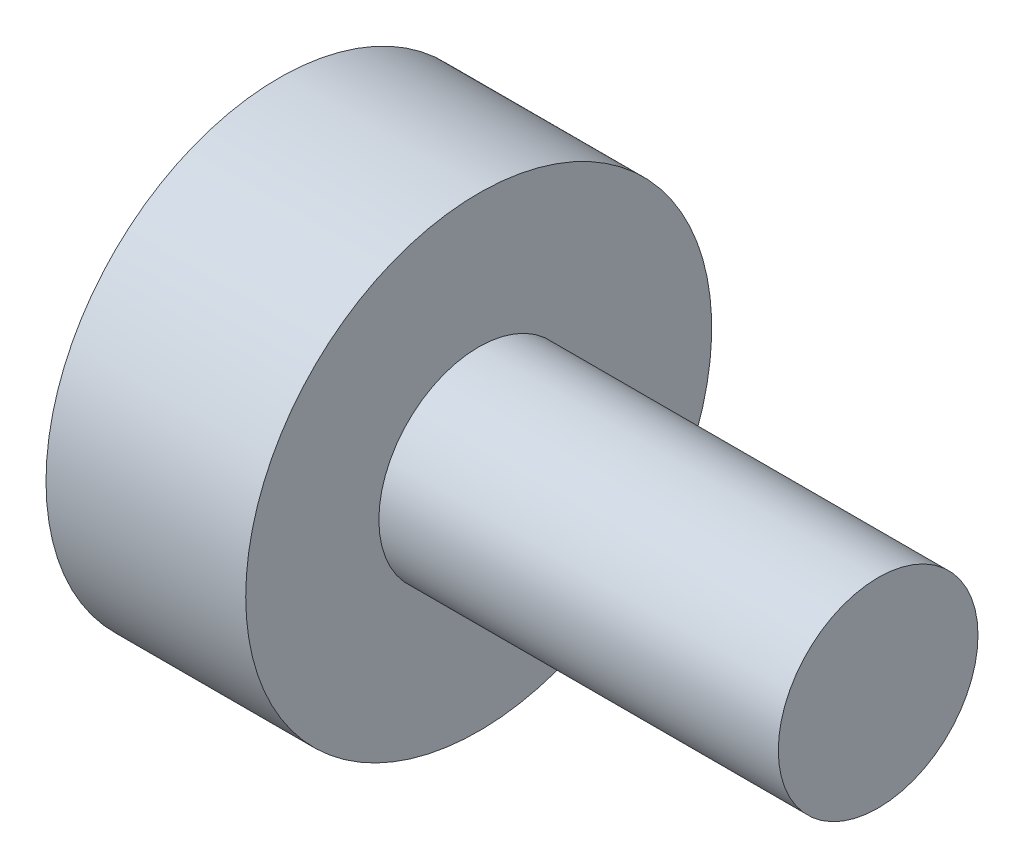
ISO-10303-21;
HEADER;
FILE_DESCRIPTION(('STEP AP214'),'2;1');
FILE_NAME('part.step','',(''),(''),'','','');
FILE_SCHEMA(('AUTOMOTIVE_DESIGN { 1 0 10303 214 1 1 1 1 }'));
ENDSEC;
DATA;
#1=APPLICATION_CONTEXT('core data for automotive mechanical design processes');
#2=APPLICATION_PROTOCOL_DEFINITION('international standard','automotive_design',2000,#1);
#3=PRODUCT_CONTEXT('',#1,'mechanical');
#4=PRODUCT('Part','Part','',(#3));
#5=PRODUCT_RELATED_PRODUCT_CATEGORY('part','',(#4));
#6=PRODUCT_DEFINITION_FORMATION('','',#4);
#7=PRODUCT_DEFINITION_CONTEXT('part definition',#1,'design');
#8=PRODUCT_DEFINITION('design','',#6,#7);
#9=PRODUCT_DEFINITION_SHAPE('','',#8);
#10=(LENGTH_UNIT() NAMED_UNIT(*) SI_UNIT(.MILLI.,.METRE.));
#11=(NAMED_UNIT(*) PLANE_ANGLE_UNIT() SI_UNIT($,.RADIAN.));
#12=(NAMED_UNIT(*) SI_UNIT($,.STERADIAN.) SOLID_ANGLE_UNIT());
#13=UNCERTAINTY_MEASURE_WITH_UNIT(LENGTH_MEASURE(1.E-05),#10,'distance_accuracy_value','');
#14=(GEOMETRIC_REPRESENTATION_CONTEXT(3) GLOBAL_UNCERTAINTY_ASSIGNED_CONTEXT((#13)) GLOBAL_UNIT_ASSIGNED_CONTEXT((#10,
#11,#12)) REPRESENTATION_CONTEXT('',''));
#15=CARTESIAN_POINT('',(0.,0.,0.));
#16=DIRECTION('',(0.,0.,1.));
#17=DIRECTION('',(1.,0.,0.));
#18=AXIS2_PLACEMENT_3D('',#15,#16,#17);
#19=CARTESIAN_POINT('',(0.,0.,0.));
#20=DIRECTION('',(1.,0.,0.));
#21=DIRECTION('',(0.,0.,-1.));
#22=AXIS2_PLACEMENT_3D('',#19,#20,#21);
#23=PLANE('',#22);
#24=CARTESIAN_POINT('',(0.,0.,0.));
#25=DIRECTION('',(-1.,0.,0.));
#26=DIRECTION('',(0.,0.,1.));
#27=AXIS2_PLACEMENT_3D('',#24,#25,#26);
#28=CIRCLE('',#27,20.);
#29=CARTESIAN_POINT('',(0.,-5.,-19.3649167310371));
#30=VERTEX_POINT('',#29);
#31=CARTESIAN_POINT('',(0.,5.,-19.3649167310371));
#32=VERTEX_POINT('',#31);
#33=EDGE_CURVE('E72',#30,#32,#28,.T.);
#34=ORIENTED_EDGE('',*,*,#33,.T.);
#35=DIRECTION('',(0.,0.,1.));
#36=VECTOR('',#35,1.);
#37=CARTESIAN_POINT('',(0.,5.,-20.));
#38=LINE('',#37,#36);
#39=CARTESIAN_POINT('',(0.,5.,0.));
#40=VERTEX_POINT('',#39);
#41=EDGE_CURVE('E53',#32,#40,#38,.T.);
#42=ORIENTED_EDGE('',*,*,#41,.T.);
#43=DIRECTION('',(0.,-1.,0.));
#44=VECTOR('',#43,1.);
#45=CARTESIAN_POINT('',(0.,0.,0.));
#46=LINE('',#45,#44);
#47=CARTESIAN_POINT('',(0.,-5.,0.));
#48=VERTEX_POINT('',#47);
#49=EDGE_CURVE('E11',#40,#48,#46,.T.);
#50=ORIENTED_EDGE('',*,*,#49,.T.);
#51=DIRECTION('',(0.,0.,1.));
#52=VECTOR('',#51,1.);
#53=CARTESIAN_POINT('',(0.,-5.,-20.));
#54=LINE('',#53,#52);
#55=EDGE_CURVE('E68',#48,#30,#54,.F.);
#56=ORIENTED_EDGE('',*,*,#55,.T.);
#57=EDGE_LOOP('',(#34,#42,#50,#56));
#58=FACE_BOUND('',#57,.T.);
#59=ADVANCED_FACE('F39',(#58),#23,.F.);
#60=CARTESIAN_POINT('',(0.,0.,0.));
#61=DIRECTION('',(-1.,0.,0.));
#62=DIRECTION('',(0.,0.,1.));
#63=AXIS2_PLACEMENT_3D('',#60,#61,#62);
#64=CYLINDRICAL_SURFACE('',#63,20.);
#65=ORIENTED_EDGE('',*,*,#33,.F.);
#66=CARTESIAN_POINT('',(0.,-5.,-19.3649167310371));
#67=CARTESIAN_POINT('',(0.138272834460871,-5.00001753395835,-19.3649007840107));
#68=CARTESIAN_POINT('',(0.276540097364984,-4.99426496909798,-19.3663971727449));
#69=CARTESIAN_POINT('',(0.552040698479361,-4.97134860364569,-19.3722985480918));
#70=CARTESIAN_POINT('',(0.689274206732196,-4.95418672314339,-19.3767030452941));
#71=CARTESIAN_POINT('',(0.961462818107449,-4.90862561902931,-19.3882931863188));
#72=CARTESIAN_POINT('',(1.09642188384802,-4.88024864351133,-19.3954733233156));
#73=CARTESIAN_POINT('',(1.36338654305593,-4.81249825831572,-19.4123951766203));
#74=CARTESIAN_POINT('',(1.49539209593624,-4.77312469762375,-19.4221369281063));
#75=CARTESIAN_POINT('',(1.75549952050959,-4.68370900604869,-19.4438931792242));
#76=CARTESIAN_POINT('',(1.88360253729201,-4.63367003976977,-19.4559070045749));
#77=CARTESIAN_POINT('',(2.13513670472043,-4.52328004787008,-19.4818672653283));
#78=CARTESIAN_POINT('',(2.25856610756187,-4.46292521002326,-19.4958144148289));
#79=CARTESIAN_POINT('',(2.49988287992364,-4.33236689620125,-19.5252419107895));
#80=CARTESIAN_POINT('',(2.6177710980402,-4.26216493485252,-19.5407220213511));
#81=CARTESIAN_POINT('',(2.84731830884538,-4.11236775524931,-19.5727948522709));
#82=CARTESIAN_POINT('',(2.95897507240795,-4.03276920695238,-19.5893879661596));
#83=CARTESIAN_POINT('',(3.17742098620076,-3.86309366475693,-19.6235608159865));
#84=CARTESIAN_POINT('',(3.28407326793451,-3.77284301478499,-19.6411534627799));
#85=CARTESIAN_POINT('',(3.48943878662241,-3.58375500650069,-19.6765329589213));
#86=CARTESIAN_POINT('',(3.58815193813974,-3.48491755580543,-19.694319810357));
#87=CARTESIAN_POINT('',(3.77704043799149,-3.2792484140741,-19.7296076802507));
#88=CARTESIAN_POINT('',(3.86721120551103,-3.17241248824931,-19.7471085412319));
#89=CARTESIAN_POINT('',(4.03831650717542,-2.95152673305184,-19.7813289236806));
#90=CARTESIAN_POINT('',(4.11925425140885,-2.83747943245802,-19.7980487155049));
#91=CARTESIAN_POINT('',(4.27248872706604,-2.6011466814452,-19.8304933840741));
#92=CARTESIAN_POINT('',(4.34464017130083,-2.47876443214353,-19.8461999180977));
#93=CARTESIAN_POINT('',(4.47831833397304,-2.22818821436213,-19.8758921313774));
#94=CARTESIAN_POINT('',(4.53984905440516,-2.09999645805248,-19.8898784582511));
#95=CARTESIAN_POINT('',(4.65178667733141,-1.83876382896457,-19.9157262673607));
#96=CARTESIAN_POINT('',(4.70220315412227,-1.70572724577506,-19.9275895767853));
#97=CARTESIAN_POINT('',(4.79155122383745,-1.43570997438047,-19.9488617721827));
#98=CARTESIAN_POINT('',(4.83048565077104,-1.29873026859731,-19.9582712637424));
#99=CARTESIAN_POINT('',(4.90874937626923,-0.97064108112435,-19.977333643164));
#100=CARTESIAN_POINT('',(4.94292401780841,-0.778207372243115,-19.9857953715887));
#101=CARTESIAN_POINT('',(4.98854765296026,-0.390497232372119,-19.9971276024621));
#102=CARTESIAN_POINT('',(4.99999697791014,-0.19522084287072,-19.9999981864302));
#103=CARTESIAN_POINT('',(5.00000213827049,0.138127913507163,-20.0000012831858));
#104=CARTESIAN_POINT('',(4.99427399752399,0.276228019110225,-19.9985663947955));
#105=CARTESIAN_POINT('',(4.97141332118513,0.551465319486925,-19.9928692349881));
#106=CARTESIAN_POINT('',(4.95427841295876,0.688602307931645,-19.9886063753472));
#107=CARTESIAN_POINT('',(4.90872988572256,0.960963487514513,-19.9773658100664));
#108=CARTESIAN_POINT('',(4.88030896286401,1.09618638112264,-19.9703863464094));
#109=CARTESIAN_POINT('',(4.81241221911679,1.36372339170858,-19.953902550352));
#110=CARTESIAN_POINT('',(4.77293227386865,1.49603640357995,-19.9443972760421));
#111=CARTESIAN_POINT('',(4.68331778193416,1.75655255567902,-19.9231417137924));
#112=CARTESIAN_POINT('',(4.63320214061524,1.88476252988487,-19.911395413059));
#113=CARTESIAN_POINT('',(4.52263895594003,2.13650267121433,-19.8859590993513));
#114=CARTESIAN_POINT('',(4.46218754300541,2.26003106437742,-19.8722683587302));
#115=CARTESIAN_POINT('',(4.33143672270069,2.50149939089758,-19.8433183513795));
#116=CARTESIAN_POINT('',(4.26114140397816,2.61944161737913,-19.8280597365604));
#117=CARTESIAN_POINT('',(4.11115040892327,2.84908010265293,-19.7963679590111));
#118=CARTESIAN_POINT('',(4.03145140224512,2.96077412785641,-19.7799343809808));
#119=CARTESIAN_POINT('',(3.86166498953842,3.17915420413932,-19.746022712636));
#120=CARTESIAN_POINT('',(3.77141396267037,3.28571095613819,-19.7285309991272));
#121=CARTESIAN_POINT('',(3.58234590171396,3.49088227770617,-19.6932622648125));
#122=CARTESIAN_POINT('',(3.48352876753023,3.58949675444343,-19.6754852406748));
#123=CARTESIAN_POINT('',(3.27794306946365,3.77816899531385,-19.6401287238781));
#124=CARTESIAN_POINT('',(3.17117188636971,3.86822391843246,-19.6225492984997));
#125=CARTESIAN_POINT('',(2.95043905083519,4.03910682813488,-19.5880885497288));
#126=CARTESIAN_POINT('',(2.8364799051134,4.1199380040702,-19.5712069863278));
#127=CARTESIAN_POINT('',(2.60025265095591,4.27303189813576,-19.538357799939));
#128=CARTESIAN_POINT('',(2.47788289218176,4.3451418279044,-19.5224084712044));
#129=CARTESIAN_POINT('',(2.22733806956989,4.47874029407629,-19.4921926968022));
#130=CARTESIAN_POINT('',(2.09916522525642,4.54023284874036,-19.477925615121));
#131=CARTESIAN_POINT('',(1.83790859550981,4.65212537637921,-19.4515047718923));
#132=CARTESIAN_POINT('',(1.70482684477968,4.70252988625197,-19.4393501464194));
#133=CARTESIAN_POINT('',(1.43472323301396,4.79184872964649,-19.4175253674924));
#134=CARTESIAN_POINT('',(1.29770236028045,4.83076591813054,-19.4078545967995));
#135=CARTESIAN_POINT('',(0.969649311262459,4.90893773164917,-19.3882580723379));
#136=CARTESIAN_POINT('',(0.777278442983483,4.94305736733936,-19.3795454346692));
#137=CARTESIAN_POINT('',(0.486786095386916,4.9772047996888,-19.3707911020722));
#138=CARTESIAN_POINT('',(0.389644148723514,4.98574860321178,-19.3685921002006));
#139=CARTESIAN_POINT('',(0.195011086099661,4.99714567938173,-19.3656540103178));
#140=CARTESIAN_POINT('',(0.0975199921468964,4.99999930458473,-19.3649148318579));
#141=CARTESIAN_POINT('',(0.,5.,-19.3649167310371));
#142=B_SPLINE_CURVE_WITH_KNOTS('',3,(#66,#67,#68,#69,#70,#71,#72,#73,#74,#75,#76,#77,#78,#79,
#80,#81,#82,#83,#84,#85,#86,#87,#88,#89,#90,#91,#92,#93,#94,#95,#96,#97,#98,#99,#100,#101,#102,
#103,#104,#105,#106,#107,#108,#109,#110,#111,#112,#113,#114,#115,#116,#117,#118,#119,#120,#121,
#122,#123,#124,#125,#126,#127,#128,#129,#130,#131,#132,#133,#134,#135,#136,#137,#138,#139,#140,
#141),.UNSPECIFIED.,.F.,.F.,(4,2,2,2,2,2,2,2,2,2,2,2,2,2,2,2,2,2,2,2,2,2,2,2,2,2,2,2,2,2,2,2,2,
2,2,2,2,4),(0.,0.414682304098706,0.829294838395686,1.24308897507314,1.65688879459903,
2.07056600330062,2.48439641808734,2.89816324957751,3.31207715798314,3.73403959703022,
4.15600657641179,4.57819856781559,5.00024332347432,5.42852178064175,5.8566385042354,
6.28438497552443,6.71202578153474,7.29745116747545,7.88286801779763,8.2970779293924,
8.71137402453764,9.12593867332562,9.54065813645484,9.95464650316356,10.3687902024789,
10.7827623953929,11.1968816404261,11.6185905521066,12.0403043921403,12.4621577186183,
12.8838647334355,13.3121294316923,13.7402316915537,14.1681584575428,14.5959787804894,
15.1810682853859,15.473544420134,15.7660024328792),.UNSPECIFIED.);
#143=EDGE_CURVE('E46',#30,#32,#142,.T.);
#144=ORIENTED_EDGE('',*,*,#143,.T.);
#145=EDGE_LOOP('',(#65,#144));
#146=FACE_BOUND('',#145,.T.);
#147=CARTESIAN_POINT('',(10.,0.,0.));
#148=DIRECTION('',(-1.,0.,0.));
#149=DIRECTION('',(0.,0.,1.));
#150=AXIS2_PLACEMENT_3D('',#147,#148,#149);
#151=CIRCLE('',#150,20.);
#152=CARTESIAN_POINT('',(10.,0.,20.));
#153=VERTEX_POINT('',#152);
#154=EDGE_CURVE('E88',#153,#153,#151,.T.);
#155=ORIENTED_EDGE('',*,*,#154,.T.);
#156=EDGE_LOOP('',(#155));
#157=FACE_BOUND('',#156,.T.);
#158=ADVANCED_FACE('F96',(#146,#157),#64,.T.);
#159=CARTESIAN_POINT('',(10.,20.,0.));
#160=DIRECTION('',(1.,0.,0.));
#161=DIRECTION('',(0.,0.,-1.));
#162=AXIS2_PLACEMENT_3D('',#159,#160,#161);
#163=PLANE('',#162);
#164=ORIENTED_EDGE('',*,*,#154,.F.);
#165=EDGE_LOOP('',(#164));
#166=FACE_BOUND('',#165,.T.);
#167=CARTESIAN_POINT('',(10.,0.,0.));
#168=DIRECTION('',(-1.,0.,0.));
#169=DIRECTION('',(0.,0.,1.));
#170=AXIS2_PLACEMENT_3D('',#167,#168,#169);
#171=CIRCLE('',#170,35.);
#172=CARTESIAN_POINT('',(10.,0.,35.));
#173=VERTEX_POINT('',#172);
#174=EDGE_CURVE('E85',#173,#173,#171,.T.);
#175=ORIENTED_EDGE('',*,*,#174,.T.);
#176=EDGE_LOOP('',(#175));
#177=FACE_BOUND('',#176,.T.);
#178=ADVANCED_FACE('F117',(#166,#177),#163,.F.);
#179=CARTESIAN_POINT('',(0.,0.,0.));
#180=DIRECTION('',(-1.,0.,0.));
#181=DIRECTION('',(0.,0.,1.));
#182=AXIS2_PLACEMENT_3D('',#179,#180,#181);
#183=CYLINDRICAL_SURFACE('',#182,35.);
#184=ORIENTED_EDGE('',*,*,#174,.F.);
#185=EDGE_LOOP('',(#184));
#186=FACE_BOUND('',#185,.T.);
#187=CARTESIAN_POINT('',(40.,0.,0.));
#188=DIRECTION('',(-1.,0.,0.));
#189=DIRECTION('',(0.,0.,1.));
#190=AXIS2_PLACEMENT_3D('',#187,#188,#189);
#191=CIRCLE('',#190,35.);
#192=CARTESIAN_POINT('',(40.,0.,35.));
#193=VERTEX_POINT('',#192);
#194=EDGE_CURVE('E82',#193,#193,#191,.T.);
#195=ORIENTED_EDGE('',*,*,#194,.T.);
#196=EDGE_LOOP('',(#195));
#197=FACE_BOUND('',#196,.T.);
#198=ADVANCED_FACE('F114',(#186,#197),#183,.T.);
#199=CARTESIAN_POINT('',(40.,35.,0.));
#200=DIRECTION('',(-1.,0.,0.));
#201=DIRECTION('',(0.,0.,1.));
#202=AXIS2_PLACEMENT_3D('',#199,#200,#201);
#203=PLANE('',#202);
#204=ORIENTED_EDGE('',*,*,#194,.F.);
#205=EDGE_LOOP('',(#204));
#206=FACE_BOUND('',#205,.T.);
#207=CARTESIAN_POINT('',(40.,0.,0.));
#208=DIRECTION('',(-1.,0.,0.));
#209=DIRECTION('',(0.,0.,1.));
#210=AXIS2_PLACEMENT_3D('',#207,#208,#209);
#211=CIRCLE('',#210,15.);
#212=CARTESIAN_POINT('',(40.,0.,15.));
#213=VERTEX_POINT('',#212);
#214=EDGE_CURVE('E76',#213,#213,#211,.T.);
#215=ORIENTED_EDGE('',*,*,#214,.T.);
#216=EDGE_LOOP('',(#215));
#217=FACE_BOUND('',#216,.T.);
#218=ADVANCED_FACE('F110',(#206,#217),#203,.F.);
#219=CARTESIAN_POINT('',(0.,0.,0.));
#220=DIRECTION('',(-1.,0.,0.));
#221=DIRECTION('',(0.,0.,1.));
#222=AXIS2_PLACEMENT_3D('',#219,#220,#221);
#223=CYLINDRICAL_SURFACE('',#222,15.);
#224=ORIENTED_EDGE('',*,*,#214,.F.);
#225=EDGE_LOOP('',(#224));
#226=FACE_BOUND('',#225,.T.);
#227=CARTESIAN_POINT('',(100.,0.,0.));
#228=DIRECTION('',(-1.,0.,0.));
#229=DIRECTION('',(0.,0.,1.));
#230=AXIS2_PLACEMENT_3D('',#227,#228,#229);
#231=CIRCLE('',#230,15.);
#232=CARTESIAN_POINT('',(100.,0.,15.));
#233=VERTEX_POINT('',#232);
#234=EDGE_CURVE('E73',#233,#233,#231,.T.);
#235=ORIENTED_EDGE('',*,*,#234,.T.);
#236=EDGE_LOOP('',(#235));
#237=FACE_BOUND('',#236,.T.);
#238=ADVANCED_FACE('F106',(#226,#237),#223,.T.);
#239=CARTESIAN_POINT('',(100.,0.,0.));
#240=DIRECTION('',(-1.,0.,0.));
#241=DIRECTION('',(0.,0.,1.));
#242=AXIS2_PLACEMENT_3D('',#239,#240,#241);
#243=PLANE('',#242);
#244=ORIENTED_EDGE('',*,*,#234,.F.);
#245=EDGE_LOOP('',(#244));
#246=FACE_BOUND('',#245,.T.);
#247=ADVANCED_FACE('F103',(#246),#243,.F.);
#248=CARTESIAN_POINT('',(0.,0.,0.));
#249=DIRECTION('',(0.,0.,1.));
#250=DIRECTION('',(1.,0.,0.));
#251=AXIS2_PLACEMENT_3D('',#248,#249,#250);
#252=PLANE('',#251);
#253=CARTESIAN_POINT('',(0.,0.,0.));
#254=DIRECTION('',(0.,0.,1.));
#255=DIRECTION('',(1.,0.,0.));
#256=AXIS2_PLACEMENT_3D('',#253,#254,#255);
#257=CIRCLE('',#256,5.);
#258=EDGE_CURVE('E65',#48,#40,#257,.T.);
#259=ORIENTED_EDGE('',*,*,#258,.F.);
#260=ORIENTED_EDGE('',*,*,#49,.F.);
#261=EDGE_LOOP('',(#259,#260));
#262=FACE_BOUND('',#261,.T.);
#263=ADVANCED_FACE('F64',(#262),#252,.F.);
#264=CARTESIAN_POINT('',(0.,0.,-20.));
#265=DIRECTION('',(0.,0.,1.));
#266=DIRECTION('',(1.,0.,0.));
#267=AXIS2_PLACEMENT_3D('',#264,#265,#266);
#268=CYLINDRICAL_SURFACE('',#267,5.);
#269=ORIENTED_EDGE('',*,*,#143,.F.);
#270=ORIENTED_EDGE('',*,*,#55,.F.);
#271=ORIENTED_EDGE('',*,*,#258,.T.);
#272=ORIENTED_EDGE('',*,*,#41,.F.);
#273=EDGE_LOOP('',(#269,#270,#271,#272));
#274=FACE_BOUND('',#273,.T.);
#275=ADVANCED_FACE('F67',(#274),#268,.F.);
#276=CLOSED_SHELL('',(#59,#158,#178,#198,#218,#238,#247,#263,#275));
#277=MANIFOLD_SOLID_BREP('B2',#276);
#278=ADVANCED_BREP_SHAPE_REPRESENTATION('',(#18,#277),#14);
#279=SHAPE_DEFINITION_REPRESENTATION(#9,#278);
ENDSEC;
END-ISO-10303-21;
